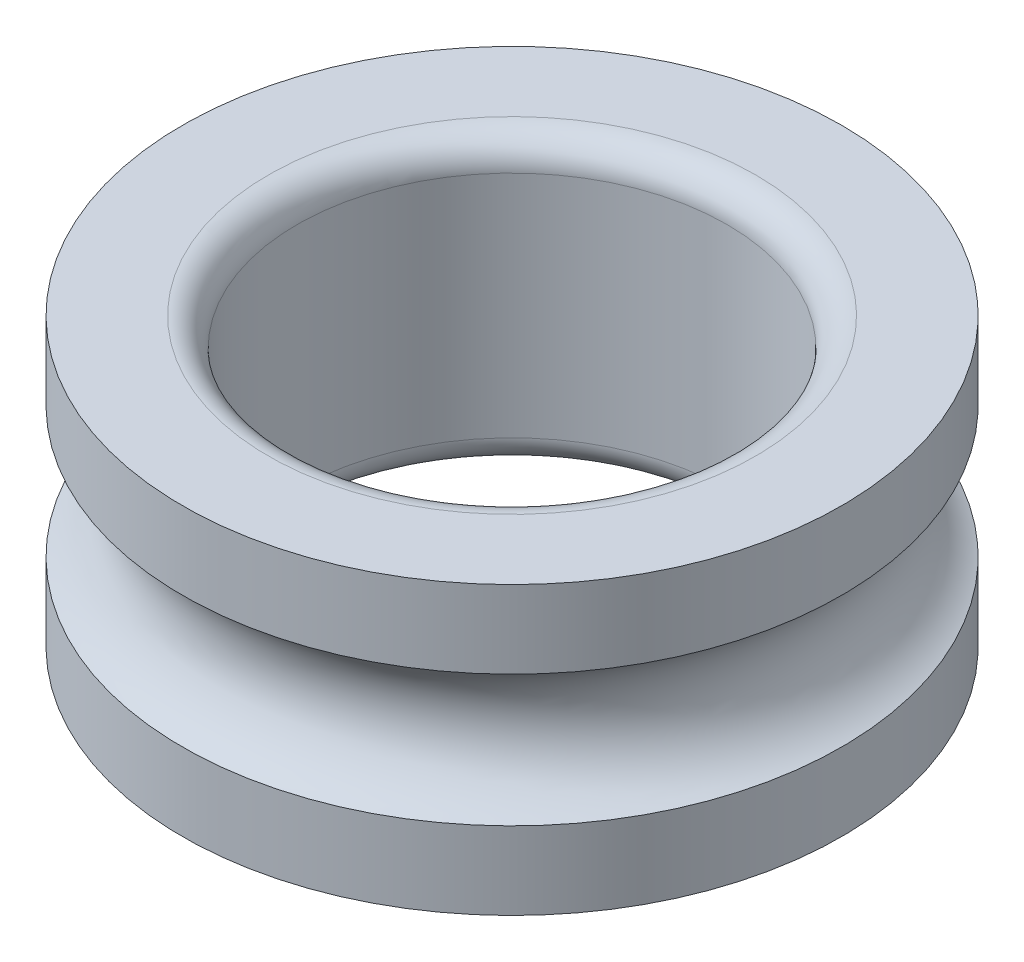
ISO-10303-21;
HEADER;
FILE_DESCRIPTION(('STEP AP214'),'2;1');
FILE_NAME('part.step','',(''),(''),'','','');
FILE_SCHEMA(('AUTOMOTIVE_DESIGN { 1 0 10303 214 1 1 1 1 }'));
ENDSEC;
DATA;
#1=APPLICATION_CONTEXT('core data for automotive mechanical design processes');
#2=APPLICATION_PROTOCOL_DEFINITION('international standard','automotive_design',2000,#1);
#3=PRODUCT_CONTEXT('',#1,'mechanical');
#4=PRODUCT('Part','Part','',(#3));
#5=PRODUCT_RELATED_PRODUCT_CATEGORY('part','',(#4));
#6=PRODUCT_DEFINITION_FORMATION('','',#4);
#7=PRODUCT_DEFINITION_CONTEXT('part definition',#1,'design');
#8=PRODUCT_DEFINITION('design','',#6,#7);
#9=PRODUCT_DEFINITION_SHAPE('','',#8);
#10=(LENGTH_UNIT() NAMED_UNIT(*) SI_UNIT(.MILLI.,.METRE.));
#11=(NAMED_UNIT(*) PLANE_ANGLE_UNIT() SI_UNIT($,.RADIAN.));
#12=(NAMED_UNIT(*) SI_UNIT($,.STERADIAN.) SOLID_ANGLE_UNIT());
#13=UNCERTAINTY_MEASURE_WITH_UNIT(LENGTH_MEASURE(1.E-05),#10,'distance_accuracy_value','');
#14=(GEOMETRIC_REPRESENTATION_CONTEXT(3) GLOBAL_UNCERTAINTY_ASSIGNED_CONTEXT((#13)) GLOBAL_UNIT_ASSIGNED_CONTEXT((#10,
#11,#12)) REPRESENTATION_CONTEXT('',''));
#15=CARTESIAN_POINT('',(0.,0.,0.));
#16=DIRECTION('',(0.,0.,1.));
#17=DIRECTION('',(1.,0.,0.));
#18=AXIS2_PLACEMENT_3D('',#15,#16,#17);
#19=CARTESIAN_POINT('',(0.,0.,0.));
#20=DIRECTION('',(0.,-1.,0.));
#21=DIRECTION('',(0.,0.,-1.));
#22=AXIS2_PLACEMENT_3D('',#19,#20,#21);
#23=TOROIDAL_SURFACE('',#22,12.5,2.5);
#24=CARTESIAN_POINT('',(0.,-2.29128784747792,0.));
#25=DIRECTION('',(0.,-1.,0.));
#26=DIRECTION('',(0.,0.,-1.));
#27=AXIS2_PLACEMENT_3D('',#24,#25,#26);
#28=CIRCLE('',#27,11.5);
#29=CARTESIAN_POINT('',(0.,-2.29128784747792,-11.5));
#30=VERTEX_POINT('',#29);
#31=EDGE_CURVE('E10',#30,#30,#28,.T.);
#32=ORIENTED_EDGE('',*,*,#31,.F.);
#33=EDGE_LOOP('',(#32));
#34=FACE_BOUND('',#33,.T.);
#35=CARTESIAN_POINT('',(0.,2.29128784747792,0.));
#36=DIRECTION('',(0.,-1.,0.));
#37=DIRECTION('',(0.,0.,-1.));
#38=AXIS2_PLACEMENT_3D('',#35,#36,#37);
#39=CIRCLE('',#38,11.5);
#40=CARTESIAN_POINT('',(0.,2.29128784747792,-11.5));
#41=VERTEX_POINT('',#40);
#42=EDGE_CURVE('E65',#41,#41,#39,.T.);
#43=ORIENTED_EDGE('',*,*,#42,.T.);
#44=EDGE_LOOP('',(#43));
#45=FACE_BOUND('',#44,.T.);
#46=ADVANCED_FACE('F37',(#34,#45),#23,.F.);
#47=CARTESIAN_POINT('',(0.,-16.2568830363602,0.));
#48=DIRECTION('',(0.,-1.,0.));
#49=DIRECTION('',(0.,0.,-1.));
#50=AXIS2_PLACEMENT_3D('',#47,#48,#49);
#51=CYLINDRICAL_SURFACE('',#50,11.5);
#52=CARTESIAN_POINT('',(0.,-5.,0.));
#53=DIRECTION('',(0.,-1.,0.));
#54=DIRECTION('',(0.,0.,-1.));
#55=AXIS2_PLACEMENT_3D('',#52,#53,#54);
#56=CIRCLE('',#55,11.5);
#57=CARTESIAN_POINT('',(0.,-5.,-11.5));
#58=VERTEX_POINT('',#57);
#59=EDGE_CURVE('E43',#58,#58,#56,.T.);
#60=ORIENTED_EDGE('',*,*,#59,.F.);
#61=EDGE_LOOP('',(#60));
#62=FACE_BOUND('',#61,.T.);
#63=ORIENTED_EDGE('',*,*,#31,.T.);
#64=EDGE_LOOP('',(#63));
#65=FACE_BOUND('',#64,.T.);
#66=ADVANCED_FACE('F102',(#62,#65),#51,.T.);
#67=CARTESIAN_POINT('',(0.,-5.,11.5));
#68=DIRECTION('',(0.,1.,0.));
#69=DIRECTION('',(0.,0.,1.));
#70=AXIS2_PLACEMENT_3D('',#67,#68,#69);
#71=PLANE('',#70);
#72=CARTESIAN_POINT('',(0.,-5.,0.));
#73=DIRECTION('',(0.,-1.,0.));
#74=DIRECTION('',(0.,0.,-1.));
#75=AXIS2_PLACEMENT_3D('',#72,#73,#74);
#76=CIRCLE('',#75,8.50000000000001);
#77=CARTESIAN_POINT('',(0.,-5.,-8.50000000000001));
#78=VERTEX_POINT('',#77);
#79=EDGE_CURVE('E47',#78,#78,#76,.T.);
#80=ORIENTED_EDGE('',*,*,#79,.F.);
#81=EDGE_LOOP('',(#80));
#82=FACE_BOUND('',#81,.T.);
#83=ORIENTED_EDGE('',*,*,#59,.T.);
#84=EDGE_LOOP('',(#83));
#85=FACE_BOUND('',#84,.T.);
#86=ADVANCED_FACE('F97',(#82,#85),#71,.F.);
#87=CARTESIAN_POINT('',(0.,-4.,0.));
#88=DIRECTION('',(0.,-1.,0.));
#89=DIRECTION('',(0.,0.,-1.));
#90=AXIS2_PLACEMENT_3D('',#87,#88,#89);
#91=TOROIDAL_SURFACE('',#90,8.5,1.);
#92=CARTESIAN_POINT('',(0.,-3.99999999999999,0.));
#93=DIRECTION('',(0.,-1.,0.));
#94=DIRECTION('',(0.,0.,-1.));
#95=AXIS2_PLACEMENT_3D('',#92,#93,#94);
#96=CIRCLE('',#95,7.5);
#97=CARTESIAN_POINT('',(0.,-3.99999999999999,-7.5));
#98=VERTEX_POINT('',#97);
#99=EDGE_CURVE('E51',#98,#98,#96,.T.);
#100=ORIENTED_EDGE('',*,*,#99,.F.);
#101=EDGE_LOOP('',(#100));
#102=FACE_BOUND('',#101,.T.);
#103=ORIENTED_EDGE('',*,*,#79,.T.);
#104=EDGE_LOOP('',(#103));
#105=FACE_BOUND('',#104,.T.);
#106=ADVANCED_FACE('F91',(#102,#105),#91,.T.);
#107=CARTESIAN_POINT('',(0.,-16.2568830363602,0.));
#108=DIRECTION('',(0.,-1.,0.));
#109=DIRECTION('',(0.,0.,-1.));
#110=AXIS2_PLACEMENT_3D('',#107,#108,#109);
#111=CYLINDRICAL_SURFACE('',#110,7.5);
#112=CARTESIAN_POINT('',(0.,3.99999999999999,0.));
#113=DIRECTION('',(0.,-1.,0.));
#114=DIRECTION('',(0.,0.,-1.));
#115=AXIS2_PLACEMENT_3D('',#112,#113,#114);
#116=CIRCLE('',#115,7.5);
#117=CARTESIAN_POINT('',(0.,3.99999999999999,-7.5));
#118=VERTEX_POINT('',#117);
#119=EDGE_CURVE('E56',#118,#118,#116,.T.);
#120=ORIENTED_EDGE('',*,*,#119,.F.);
#121=EDGE_LOOP('',(#120));
#122=FACE_BOUND('',#121,.T.);
#123=ORIENTED_EDGE('',*,*,#99,.T.);
#124=EDGE_LOOP('',(#123));
#125=FACE_BOUND('',#124,.T.);
#126=ADVANCED_FACE('F85',(#122,#125),#111,.F.);
#127=CARTESIAN_POINT('',(0.,4.,0.));
#128=DIRECTION('',(0.,-1.,0.));
#129=DIRECTION('',(0.,0.,-1.));
#130=AXIS2_PLACEMENT_3D('',#127,#128,#129);
#131=TOROIDAL_SURFACE('',#130,8.5,0.999999999999999);
#132=CARTESIAN_POINT('',(0.,5.,0.));
#133=DIRECTION('',(0.,-1.,0.));
#134=DIRECTION('',(0.,0.,-1.));
#135=AXIS2_PLACEMENT_3D('',#132,#133,#134);
#136=CIRCLE('',#135,8.50000000000001);
#137=CARTESIAN_POINT('',(0.,5.,-8.50000000000001));
#138=VERTEX_POINT('',#137);
#139=EDGE_CURVE('E59',#138,#138,#136,.T.);
#140=ORIENTED_EDGE('',*,*,#139,.F.);
#141=EDGE_LOOP('',(#140));
#142=FACE_BOUND('',#141,.T.);
#143=ORIENTED_EDGE('',*,*,#119,.T.);
#144=EDGE_LOOP('',(#143));
#145=FACE_BOUND('',#144,.T.);
#146=ADVANCED_FACE('F79',(#142,#145),#131,.T.);
#147=CARTESIAN_POINT('',(0.,5.,11.5));
#148=DIRECTION('',(0.,-1.,0.));
#149=DIRECTION('',(0.,0.,-1.));
#150=AXIS2_PLACEMENT_3D('',#147,#148,#149);
#151=PLANE('',#150);
#152=CARTESIAN_POINT('',(0.,5.,0.));
#153=DIRECTION('',(0.,-1.,0.));
#154=DIRECTION('',(0.,0.,-1.));
#155=AXIS2_PLACEMENT_3D('',#152,#153,#154);
#156=CIRCLE('',#155,11.5);
#157=CARTESIAN_POINT('',(0.,5.,-11.5));
#158=VERTEX_POINT('',#157);
#159=EDGE_CURVE('E62',#158,#158,#156,.T.);
#160=ORIENTED_EDGE('',*,*,#159,.F.);
#161=EDGE_LOOP('',(#160));
#162=FACE_BOUND('',#161,.T.);
#163=ORIENTED_EDGE('',*,*,#139,.T.);
#164=EDGE_LOOP('',(#163));
#165=FACE_BOUND('',#164,.T.);
#166=ADVANCED_FACE('F73',(#162,#165),#151,.F.);
#167=CARTESIAN_POINT('',(0.,-16.2568830363602,0.));
#168=DIRECTION('',(0.,-1.,0.));
#169=DIRECTION('',(0.,0.,-1.));
#170=AXIS2_PLACEMENT_3D('',#167,#168,#169);
#171=CYLINDRICAL_SURFACE('',#170,11.5);
#172=ORIENTED_EDGE('',*,*,#42,.F.);
#173=EDGE_LOOP('',(#172));
#174=FACE_BOUND('',#173,.T.);
#175=ORIENTED_EDGE('',*,*,#159,.T.);
#176=EDGE_LOOP('',(#175));
#177=FACE_BOUND('',#176,.T.);
#178=ADVANCED_FACE('F70',(#174,#177),#171,.T.);
#179=CLOSED_SHELL('',(#46,#66,#86,#106,#126,#146,#166,#178));
#180=MANIFOLD_SOLID_BREP('B2',#179);
#181=ADVANCED_BREP_SHAPE_REPRESENTATION('',(#18,#180),#14);
#182=SHAPE_DEFINITION_REPRESENTATION(#9,#181);
ENDSEC;
END-ISO-10303-21;
